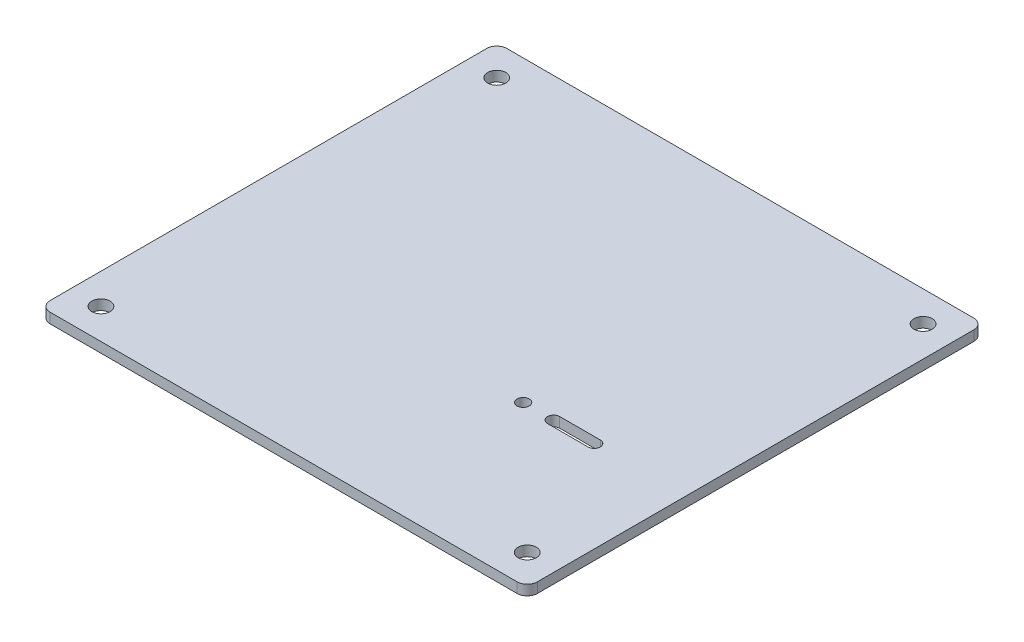
ISO-10303-21;
HEADER;
FILE_DESCRIPTION(('STEP AP214'),'2;1');
FILE_NAME('part.step','',(''),(''),'','','');
FILE_SCHEMA(('AUTOMOTIVE_DESIGN { 1 0 10303 214 1 1 1 1 }'));
ENDSEC;
DATA;
#1=APPLICATION_CONTEXT('core data for automotive mechanical design processes');
#2=APPLICATION_PROTOCOL_DEFINITION('international standard','automotive_design',2000,#1);
#3=PRODUCT_CONTEXT('',#1,'mechanical');
#4=PRODUCT('Part','Part','',(#3));
#5=PRODUCT_RELATED_PRODUCT_CATEGORY('part','',(#4));
#6=PRODUCT_DEFINITION_FORMATION('','',#4);
#7=PRODUCT_DEFINITION_CONTEXT('part definition',#1,'design');
#8=PRODUCT_DEFINITION('design','',#6,#7);
#9=PRODUCT_DEFINITION_SHAPE('','',#8);
#10=(LENGTH_UNIT() NAMED_UNIT(*) SI_UNIT(.MILLI.,.METRE.));
#11=(NAMED_UNIT(*) PLANE_ANGLE_UNIT() SI_UNIT($,.RADIAN.));
#12=(NAMED_UNIT(*) SI_UNIT($,.STERADIAN.) SOLID_ANGLE_UNIT());
#13=UNCERTAINTY_MEASURE_WITH_UNIT(LENGTH_MEASURE(1.E-05),#10,'distance_accuracy_value','');
#14=(GEOMETRIC_REPRESENTATION_CONTEXT(3) GLOBAL_UNCERTAINTY_ASSIGNED_CONTEXT((#13)) GLOBAL_UNIT_ASSIGNED_CONTEXT((#10,
#11,#12)) REPRESENTATION_CONTEXT('',''));
#15=CARTESIAN_POINT('',(0.,0.,0.));
#16=DIRECTION('',(0.,0.,1.));
#17=DIRECTION('',(1.,0.,0.));
#18=AXIS2_PLACEMENT_3D('',#15,#16,#17);
#19=CARTESIAN_POINT('',(0.,5.,0.));
#20=DIRECTION('',(1.,0.,0.));
#21=DIRECTION('',(0.,0.,-1.));
#22=AXIS2_PLACEMENT_3D('',#19,#20,#21);
#23=PLANE('',#22);
#24=DIRECTION('',(0.,0.,1.));
#25=VECTOR('',#24,1.);
#26=CARTESIAN_POINT('',(0.,5.,0.));
#27=LINE('',#26,#25);
#28=CARTESIAN_POINT('',(0.,5.,-220.));
#29=VERTEX_POINT('',#28);
#30=CARTESIAN_POINT('',(0.,5.,-5.));
#31=VERTEX_POINT('',#30);
#32=EDGE_CURVE('E181',#29,#31,#27,.T.);
#33=ORIENTED_EDGE('',*,*,#32,.F.);
#34=DIRECTION('',(0.,1.,0.));
#35=VECTOR('',#34,1.);
#36=CARTESIAN_POINT('',(0.,0.,-220.));
#37=LINE('',#36,#35);
#38=CARTESIAN_POINT('',(0.,0.,-220.));
#39=VERTEX_POINT('',#38);
#40=EDGE_CURVE('E206',#29,#39,#37,.F.);
#41=ORIENTED_EDGE('',*,*,#40,.T.);
#42=DIRECTION('',(0.,0.,1.));
#43=VECTOR('',#42,1.);
#44=CARTESIAN_POINT('',(0.,0.,0.));
#45=LINE('',#44,#43);
#46=CARTESIAN_POINT('',(0.,0.,-5.));
#47=VERTEX_POINT('',#46);
#48=EDGE_CURVE('E171',#39,#47,#45,.T.);
#49=ORIENTED_EDGE('',*,*,#48,.T.);
#50=DIRECTION('',(0.,-1.,0.));
#51=VECTOR('',#50,1.);
#52=CARTESIAN_POINT('',(0.,5.,-5.));
#53=LINE('',#52,#51);
#54=EDGE_CURVE('E204',#47,#31,#53,.F.);
#55=ORIENTED_EDGE('',*,*,#54,.T.);
#56=EDGE_LOOP('',(#33,#41,#49,#55));
#57=FACE_BOUND('',#56,.T.);
#58=ADVANCED_FACE('F35',(#57),#23,.F.);
#59=CARTESIAN_POINT('',(0.,5.,0.));
#60=DIRECTION('',(0.,0.,-1.));
#61=DIRECTION('',(-1.,0.,0.));
#62=AXIS2_PLACEMENT_3D('',#59,#60,#61);
#63=PLANE('',#62);
#64=DIRECTION('',(1.,0.,0.));
#65=VECTOR('',#64,1.);
#66=CARTESIAN_POINT('',(0.,0.,0.));
#67=LINE('',#66,#65);
#68=CARTESIAN_POINT('',(5.,0.,0.));
#69=VERTEX_POINT('',#68);
#70=CARTESIAN_POINT('',(235.,0.,0.));
#71=VERTEX_POINT('',#70);
#72=EDGE_CURVE('E185',#69,#71,#67,.T.);
#73=ORIENTED_EDGE('',*,*,#72,.T.);
#74=DIRECTION('',(0.,1.,0.));
#75=VECTOR('',#74,1.);
#76=CARTESIAN_POINT('',(235.,5.,0.));
#77=LINE('',#76,#75);
#78=CARTESIAN_POINT('',(235.,5.,0.));
#79=VERTEX_POINT('',#78);
#80=EDGE_CURVE('E11',#71,#79,#77,.T.);
#81=ORIENTED_EDGE('',*,*,#80,.T.);
#82=DIRECTION('',(1.,0.,0.));
#83=VECTOR('',#82,1.);
#84=CARTESIAN_POINT('',(0.,5.,0.));
#85=LINE('',#84,#83);
#86=CARTESIAN_POINT('',(5.,5.,0.));
#87=VERTEX_POINT('',#86);
#88=EDGE_CURVE('E184',#87,#79,#85,.T.);
#89=ORIENTED_EDGE('',*,*,#88,.F.);
#90=DIRECTION('',(0.,-1.,0.));
#91=VECTOR('',#90,1.);
#92=CARTESIAN_POINT('',(5.,5.,0.));
#93=LINE('',#92,#91);
#94=EDGE_CURVE('E43',#87,#69,#93,.T.);
#95=ORIENTED_EDGE('',*,*,#94,.T.);
#96=EDGE_LOOP('',(#73,#81,#89,#95));
#97=FACE_BOUND('',#96,.T.);
#98=ADVANCED_FACE('F220',(#97),#63,.F.);
#99=CARTESIAN_POINT('',(0.,5.,0.));
#100=DIRECTION('',(0.,-1.,0.));
#101=DIRECTION('',(0.,0.,-1.));
#102=AXIS2_PLACEMENT_3D('',#99,#100,#101);
#103=PLANE('',#102);
#104=CARTESIAN_POINT('',(15.,5.,-15.));
#105=DIRECTION('',(0.,1.,0.));
#106=DIRECTION('',(0.,0.,1.));
#107=AXIS2_PLACEMENT_3D('',#104,#105,#106);
#108=CIRCLE('',#107,4.49999999999999);
#109=CARTESIAN_POINT('',(15.,5.,-10.5));
#110=VERTEX_POINT('',#109);
#111=EDGE_CURVE('E321',#110,#110,#108,.T.);
#112=ORIENTED_EDGE('',*,*,#111,.F.);
#113=EDGE_LOOP('',(#112));
#114=FACE_BOUND('',#113,.T.);
#115=CARTESIAN_POINT('',(225.,5.,-15.));
#116=DIRECTION('',(0.,1.,0.));
#117=DIRECTION('',(0.,0.,1.));
#118=AXIS2_PLACEMENT_3D('',#115,#116,#117);
#119=CIRCLE('',#118,4.49999999999998);
#120=CARTESIAN_POINT('',(225.,5.,-10.5));
#121=VERTEX_POINT('',#120);
#122=EDGE_CURVE('E323',#121,#121,#119,.T.);
#123=ORIENTED_EDGE('',*,*,#122,.F.);
#124=EDGE_LOOP('',(#123));
#125=FACE_BOUND('',#124,.T.);
#126=CARTESIAN_POINT('',(225.,5.,-210.));
#127=DIRECTION('',(0.,1.,0.));
#128=DIRECTION('',(0.,0.,1.));
#129=AXIS2_PLACEMENT_3D('',#126,#127,#128);
#130=CIRCLE('',#129,4.49999999999998);
#131=CARTESIAN_POINT('',(225.,5.,-205.5));
#132=VERTEX_POINT('',#131);
#133=EDGE_CURVE('E331',#132,#132,#130,.T.);
#134=ORIENTED_EDGE('',*,*,#133,.F.);
#135=EDGE_LOOP('',(#134));
#136=FACE_BOUND('',#135,.T.);
#137=CARTESIAN_POINT('',(15.,5.,-210.));
#138=DIRECTION('',(0.,1.,0.));
#139=DIRECTION('',(0.,0.,1.));
#140=AXIS2_PLACEMENT_3D('',#137,#138,#139);
#141=CIRCLE('',#140,4.49999999999999);
#142=CARTESIAN_POINT('',(15.,5.,-205.5));
#143=VERTEX_POINT('',#142);
#144=EDGE_CURVE('E337',#143,#143,#141,.T.);
#145=ORIENTED_EDGE('',*,*,#144,.F.);
#146=EDGE_LOOP('',(#145));
#147=FACE_BOUND('',#146,.T.);
#148=DIRECTION('',(1.,0.,0.));
#149=VECTOR('',#148,1.);
#150=CARTESIAN_POINT('',(174.999156247034,5.,-75.));
#151=LINE('',#150,#149);
#152=CARTESIAN_POINT('',(174.999156247034,5.,-75.));
#153=VERTEX_POINT('',#152);
#154=CARTESIAN_POINT('',(194.999156247034,5.,-75.));
#155=VERTEX_POINT('',#154);
#156=EDGE_CURVE('E164',#153,#155,#151,.T.);
#157=ORIENTED_EDGE('',*,*,#156,.F.);
#158=CARTESIAN_POINT('',(174.999156247034,5.,-78.));
#159=DIRECTION('',(0.,1.,0.));
#160=DIRECTION('',(0.,0.,1.));
#161=AXIS2_PLACEMENT_3D('',#158,#159,#160);
#162=CIRCLE('',#161,3.);
#163=CARTESIAN_POINT('',(174.999156247034,5.,-81.));
#164=VERTEX_POINT('',#163);
#165=EDGE_CURVE('E134',#164,#153,#162,.T.);
#166=ORIENTED_EDGE('',*,*,#165,.F.);
#167=DIRECTION('',(-1.,0.,0.));
#168=VECTOR('',#167,1.);
#169=CARTESIAN_POINT('',(174.999156247034,5.,-81.));
#170=LINE('',#169,#168);
#171=CARTESIAN_POINT('',(194.999156247034,5.,-81.));
#172=VERTEX_POINT('',#171);
#173=EDGE_CURVE('E152',#172,#164,#170,.T.);
#174=ORIENTED_EDGE('',*,*,#173,.F.);
#175=CARTESIAN_POINT('',(194.999156247034,5.,-78.));
#176=DIRECTION('',(0.,1.,0.));
#177=DIRECTION('',(0.,0.,1.));
#178=AXIS2_PLACEMENT_3D('',#175,#176,#177);
#179=CIRCLE('',#178,3.);
#180=EDGE_CURVE('E155',#155,#172,#179,.T.);
#181=ORIENTED_EDGE('',*,*,#180,.F.);
#182=EDGE_LOOP('',(#157,#166,#174,#181));
#183=FACE_BOUND('',#182,.T.);
#184=CARTESIAN_POINT('',(159.999156247034,5.,-78.));
#185=DIRECTION('',(0.,1.,0.));
#186=DIRECTION('',(0.,0.,1.));
#187=AXIS2_PLACEMENT_3D('',#184,#185,#186);
#188=CIRCLE('',#187,2.99999999999996);
#189=CARTESIAN_POINT('',(159.999156247034,5.,-75.));
#190=VERTEX_POINT('',#189);
#191=EDGE_CURVE('E177',#190,#190,#188,.T.);
#192=ORIENTED_EDGE('',*,*,#191,.F.);
#193=EDGE_LOOP('',(#192));
#194=FACE_BOUND('',#193,.T.);
#195=DIRECTION('',(-1.,0.,0.));
#196=VECTOR('',#195,1.);
#197=CARTESIAN_POINT('',(240.,5.,-225.));
#198=LINE('',#197,#196);
#199=CARTESIAN_POINT('',(235.,5.,-225.));
#200=VERTEX_POINT('',#199);
#201=CARTESIAN_POINT('',(5.,5.,-225.));
#202=VERTEX_POINT('',#201);
#203=EDGE_CURVE('E242',#200,#202,#198,.T.);
#204=ORIENTED_EDGE('',*,*,#203,.T.);
#205=CARTESIAN_POINT('',(5.,5.,-220.));
#206=DIRECTION('',(0.,-1.,0.));
#207=DIRECTION('',(0.,0.,-1.));
#208=AXIS2_PLACEMENT_3D('',#205,#206,#207);
#209=CIRCLE('',#208,5.);
#210=EDGE_CURVE('E202',#202,#29,#209,.F.);
#211=ORIENTED_EDGE('',*,*,#210,.T.);
#212=ORIENTED_EDGE('',*,*,#32,.T.);
#213=CARTESIAN_POINT('',(5.,5.,-5.));
#214=DIRECTION('',(0.,-1.,0.));
#215=DIRECTION('',(0.,0.,-1.));
#216=AXIS2_PLACEMENT_3D('',#213,#214,#215);
#217=CIRCLE('',#216,5.);
#218=EDGE_CURVE('E196',#31,#87,#217,.F.);
#219=ORIENTED_EDGE('',*,*,#218,.T.);
#220=ORIENTED_EDGE('',*,*,#88,.T.);
#221=CARTESIAN_POINT('',(235.,5.,-5.));
#222=DIRECTION('',(0.,-1.,0.));
#223=DIRECTION('',(0.,0.,-1.));
#224=AXIS2_PLACEMENT_3D('',#221,#222,#223);
#225=CIRCLE('',#224,5.);
#226=CARTESIAN_POINT('',(240.,5.,-5.));
#227=VERTEX_POINT('',#226);
#228=EDGE_CURVE('E198',#79,#227,#225,.F.);
#229=ORIENTED_EDGE('',*,*,#228,.T.);
#230=DIRECTION('',(0.,0.,1.));
#231=VECTOR('',#230,1.);
#232=CARTESIAN_POINT('',(240.,5.,-200.));
#233=LINE('',#232,#231);
#234=CARTESIAN_POINT('',(240.,5.,-220.));
#235=VERTEX_POINT('',#234);
#236=EDGE_CURVE('E158',#235,#227,#233,.T.);
#237=ORIENTED_EDGE('',*,*,#236,.F.);
#238=CARTESIAN_POINT('',(235.,5.,-220.));
#239=DIRECTION('',(0.,-1.,0.));
#240=DIRECTION('',(0.,0.,-1.));
#241=AXIS2_PLACEMENT_3D('',#238,#239,#240);
#242=CIRCLE('',#241,5.);
#243=EDGE_CURVE('E200',#235,#200,#242,.F.);
#244=ORIENTED_EDGE('',*,*,#243,.T.);
#245=EDGE_LOOP('',(#204,#211,#212,#219,#220,#229,#237,#244));
#246=FACE_BOUND('',#245,.T.);
#247=ADVANCED_FACE('F230',(#114,#125,#136,#147,#183,#194,#246),#103,.F.);
#248=CARTESIAN_POINT('',(0.,0.,0.));
#249=DIRECTION('',(0.,-1.,0.));
#250=DIRECTION('',(0.,0.,-1.));
#251=AXIS2_PLACEMENT_3D('',#248,#249,#250);
#252=PLANE('',#251);
#253=CARTESIAN_POINT('',(15.,0.,-15.));
#254=DIRECTION('',(0.,1.,0.));
#255=DIRECTION('',(0.,0.,1.));
#256=AXIS2_PLACEMENT_3D('',#253,#254,#255);
#257=CIRCLE('',#256,4.5);
#258=CARTESIAN_POINT('',(15.,0.,-10.5));
#259=VERTEX_POINT('',#258);
#260=EDGE_CURVE('E318',#259,#259,#257,.T.);
#261=ORIENTED_EDGE('',*,*,#260,.T.);
#262=EDGE_LOOP('',(#261));
#263=FACE_BOUND('',#262,.T.);
#264=CARTESIAN_POINT('',(225.,0.,-15.));
#265=DIRECTION('',(0.,1.,0.));
#266=DIRECTION('',(0.,0.,1.));
#267=AXIS2_PLACEMENT_3D('',#264,#265,#266);
#268=CIRCLE('',#267,4.5);
#269=CARTESIAN_POINT('',(225.,0.,-10.5));
#270=VERTEX_POINT('',#269);
#271=EDGE_CURVE('E328',#270,#270,#268,.T.);
#272=ORIENTED_EDGE('',*,*,#271,.T.);
#273=EDGE_LOOP('',(#272));
#274=FACE_BOUND('',#273,.T.);
#275=CARTESIAN_POINT('',(225.,0.,-210.));
#276=DIRECTION('',(0.,1.,0.));
#277=DIRECTION('',(0.,0.,1.));
#278=AXIS2_PLACEMENT_3D('',#275,#276,#277);
#279=CIRCLE('',#278,4.5);
#280=CARTESIAN_POINT('',(225.,0.,-205.5));
#281=VERTEX_POINT('',#280);
#282=EDGE_CURVE('E334',#281,#281,#279,.T.);
#283=ORIENTED_EDGE('',*,*,#282,.T.);
#284=EDGE_LOOP('',(#283));
#285=FACE_BOUND('',#284,.T.);
#286=CARTESIAN_POINT('',(15.,0.,-210.));
#287=DIRECTION('',(0.,1.,0.));
#288=DIRECTION('',(0.,0.,1.));
#289=AXIS2_PLACEMENT_3D('',#286,#287,#288);
#290=CIRCLE('',#289,4.5);
#291=CARTESIAN_POINT('',(15.,0.,-205.5));
#292=VERTEX_POINT('',#291);
#293=EDGE_CURVE('E245',#292,#292,#290,.T.);
#294=ORIENTED_EDGE('',*,*,#293,.T.);
#295=EDGE_LOOP('',(#294));
#296=FACE_BOUND('',#295,.T.);
#297=ORIENTED_EDGE('',*,*,#48,.F.);
#298=CARTESIAN_POINT('',(5.,0.,-220.));
#299=DIRECTION('',(0.,-1.,0.));
#300=DIRECTION('',(0.,0.,-1.));
#301=AXIS2_PLACEMENT_3D('',#298,#299,#300);
#302=CIRCLE('',#301,5.);
#303=CARTESIAN_POINT('',(5.,0.,-225.));
#304=VERTEX_POINT('',#303);
#305=EDGE_CURVE('E212',#39,#304,#302,.T.);
#306=ORIENTED_EDGE('',*,*,#305,.T.);
#307=DIRECTION('',(-1.,0.,0.));
#308=VECTOR('',#307,1.);
#309=CARTESIAN_POINT('',(240.,0.,-225.));
#310=LINE('',#309,#308);
#311=CARTESIAN_POINT('',(235.,0.,-225.));
#312=VERTEX_POINT('',#311);
#313=EDGE_CURVE('E236',#312,#304,#310,.T.);
#314=ORIENTED_EDGE('',*,*,#313,.F.);
#315=CARTESIAN_POINT('',(235.,0.,-220.));
#316=DIRECTION('',(0.,-1.,0.));
#317=DIRECTION('',(0.,0.,-1.));
#318=AXIS2_PLACEMENT_3D('',#315,#316,#317);
#319=CIRCLE('',#318,5.);
#320=CARTESIAN_POINT('',(240.,0.,-220.));
#321=VERTEX_POINT('',#320);
#322=EDGE_CURVE('E210',#312,#321,#319,.T.);
#323=ORIENTED_EDGE('',*,*,#322,.T.);
#324=DIRECTION('',(0.,0.,1.));
#325=VECTOR('',#324,1.);
#326=CARTESIAN_POINT('',(240.,0.,-200.));
#327=LINE('',#326,#325);
#328=CARTESIAN_POINT('',(240.,0.,-5.));
#329=VERTEX_POINT('',#328);
#330=EDGE_CURVE('E180',#321,#329,#327,.T.);
#331=ORIENTED_EDGE('',*,*,#330,.T.);
#332=CARTESIAN_POINT('',(235.,0.,-5.));
#333=DIRECTION('',(0.,-1.,0.));
#334=DIRECTION('',(0.,0.,-1.));
#335=AXIS2_PLACEMENT_3D('',#332,#333,#334);
#336=CIRCLE('',#335,5.);
#337=EDGE_CURVE('E50',#329,#71,#336,.T.);
#338=ORIENTED_EDGE('',*,*,#337,.T.);
#339=ORIENTED_EDGE('',*,*,#72,.F.);
#340=CARTESIAN_POINT('',(5.,0.,-5.));
#341=DIRECTION('',(0.,-1.,0.));
#342=DIRECTION('',(0.,0.,-1.));
#343=AXIS2_PLACEMENT_3D('',#340,#341,#342);
#344=CIRCLE('',#343,5.);
#345=EDGE_CURVE('E58',#69,#47,#344,.T.);
#346=ORIENTED_EDGE('',*,*,#345,.T.);
#347=EDGE_LOOP('',(#297,#306,#314,#323,#331,#338,#339,#346));
#348=FACE_BOUND('',#347,.T.);
#349=CARTESIAN_POINT('',(174.999156247034,0.,-78.));
#350=DIRECTION('',(0.,1.,0.));
#351=DIRECTION('',(0.,0.,1.));
#352=AXIS2_PLACEMENT_3D('',#349,#350,#351);
#353=CIRCLE('',#352,3.);
#354=CARTESIAN_POINT('',(174.999156247034,0.,-81.));
#355=VERTEX_POINT('',#354);
#356=CARTESIAN_POINT('',(174.999156247034,0.,-75.));
#357=VERTEX_POINT('',#356);
#358=EDGE_CURVE('E131',#355,#357,#353,.T.);
#359=ORIENTED_EDGE('',*,*,#358,.T.);
#360=DIRECTION('',(1.,0.,0.));
#361=VECTOR('',#360,1.);
#362=CARTESIAN_POINT('',(174.999156247034,0.,-75.));
#363=LINE('',#362,#361);
#364=CARTESIAN_POINT('',(194.999156247034,0.,-75.));
#365=VERTEX_POINT('',#364);
#366=EDGE_CURVE('E143',#357,#365,#363,.T.);
#367=ORIENTED_EDGE('',*,*,#366,.T.);
#368=CARTESIAN_POINT('',(194.999156247034,0.,-78.));
#369=DIRECTION('',(0.,1.,0.));
#370=DIRECTION('',(0.,0.,1.));
#371=AXIS2_PLACEMENT_3D('',#368,#369,#370);
#372=CIRCLE('',#371,3.);
#373=CARTESIAN_POINT('',(194.999156247034,0.,-81.));
#374=VERTEX_POINT('',#373);
#375=EDGE_CURVE('E147',#365,#374,#372,.T.);
#376=ORIENTED_EDGE('',*,*,#375,.T.);
#377=DIRECTION('',(-1.,0.,0.));
#378=VECTOR('',#377,1.);
#379=CARTESIAN_POINT('',(174.999156247034,0.,-81.));
#380=LINE('',#379,#378);
#381=EDGE_CURVE('E139',#374,#355,#380,.T.);
#382=ORIENTED_EDGE('',*,*,#381,.T.);
#383=EDGE_LOOP('',(#359,#367,#376,#382));
#384=FACE_BOUND('',#383,.T.);
#385=CARTESIAN_POINT('',(159.999156247034,0.,-78.));
#386=DIRECTION('',(0.,1.,0.));
#387=DIRECTION('',(0.,0.,1.));
#388=AXIS2_PLACEMENT_3D('',#385,#386,#387);
#389=CIRCLE('',#388,2.99999999999996);
#390=CARTESIAN_POINT('',(159.999156247034,0.,-75.));
#391=VERTEX_POINT('',#390);
#392=EDGE_CURVE('E165',#391,#391,#389,.T.);
#393=ORIENTED_EDGE('',*,*,#392,.T.);
#394=EDGE_LOOP('',(#393));
#395=FACE_BOUND('',#394,.T.);
#396=ADVANCED_FACE('F149',(#263,#274,#285,#296,#348,#384,#395),#252,.T.);
#397=CARTESIAN_POINT('',(159.999156247034,0.,-78.));
#398=DIRECTION('',(0.,1.,0.));
#399=DIRECTION('',(0.,0.,1.));
#400=AXIS2_PLACEMENT_3D('',#397,#398,#399);
#401=CYLINDRICAL_SURFACE('',#400,2.99999999999996);
#402=ORIENTED_EDGE('',*,*,#392,.F.);
#403=EDGE_LOOP('',(#402));
#404=FACE_BOUND('',#403,.T.);
#405=ORIENTED_EDGE('',*,*,#191,.T.);
#406=EDGE_LOOP('',(#405));
#407=FACE_BOUND('',#406,.T.);
#408=ADVANCED_FACE('F275',(#404,#407),#401,.F.);
#409=CARTESIAN_POINT('',(174.999156247034,0.,-78.));
#410=DIRECTION('',(0.,1.,0.));
#411=DIRECTION('',(0.,0.,1.));
#412=AXIS2_PLACEMENT_3D('',#409,#410,#411);
#413=CYLINDRICAL_SURFACE('',#412,3.);
#414=ORIENTED_EDGE('',*,*,#165,.T.);
#415=DIRECTION('',(0.,1.,0.));
#416=VECTOR('',#415,1.);
#417=CARTESIAN_POINT('',(174.999156247034,0.,-75.));
#418=LINE('',#417,#416);
#419=EDGE_CURVE('E127',#357,#153,#418,.T.);
#420=ORIENTED_EDGE('',*,*,#419,.F.);
#421=ORIENTED_EDGE('',*,*,#358,.F.);
#422=DIRECTION('',(0.,1.,0.));
#423=VECTOR('',#422,1.);
#424=CARTESIAN_POINT('',(174.999156247034,0.,-81.));
#425=LINE('',#424,#423);
#426=EDGE_CURVE('E169',#355,#164,#425,.T.);
#427=ORIENTED_EDGE('',*,*,#426,.T.);
#428=EDGE_LOOP('',(#414,#420,#421,#427));
#429=FACE_BOUND('',#428,.T.);
#430=ADVANCED_FACE('F129',(#429),#413,.F.);
#431=CARTESIAN_POINT('',(174.999156247034,0.,-81.));
#432=DIRECTION('',(0.,0.,-1.));
#433=DIRECTION('',(-1.,0.,0.));
#434=AXIS2_PLACEMENT_3D('',#431,#432,#433);
#435=PLANE('',#434);
#436=ORIENTED_EDGE('',*,*,#173,.T.);
#437=ORIENTED_EDGE('',*,*,#426,.F.);
#438=ORIENTED_EDGE('',*,*,#381,.F.);
#439=DIRECTION('',(0.,1.,0.));
#440=VECTOR('',#439,1.);
#441=CARTESIAN_POINT('',(194.999156247034,0.,-81.));
#442=LINE('',#441,#440);
#443=EDGE_CURVE('E172',#374,#172,#442,.T.);
#444=ORIENTED_EDGE('',*,*,#443,.T.);
#445=EDGE_LOOP('',(#436,#437,#438,#444));
#446=FACE_BOUND('',#445,.T.);
#447=ADVANCED_FACE('F285',(#446),#435,.F.);
#448=CARTESIAN_POINT('',(194.999156247034,0.,-78.));
#449=DIRECTION('',(0.,1.,0.));
#450=DIRECTION('',(0.,0.,1.));
#451=AXIS2_PLACEMENT_3D('',#448,#449,#450);
#452=CYLINDRICAL_SURFACE('',#451,3.);
#453=ORIENTED_EDGE('',*,*,#180,.T.);
#454=ORIENTED_EDGE('',*,*,#443,.F.);
#455=ORIENTED_EDGE('',*,*,#375,.F.);
#456=DIRECTION('',(0.,1.,0.));
#457=VECTOR('',#456,1.);
#458=CARTESIAN_POINT('',(194.999156247034,0.,-75.));
#459=LINE('',#458,#457);
#460=EDGE_CURVE('E138',#365,#155,#459,.T.);
#461=ORIENTED_EDGE('',*,*,#460,.T.);
#462=EDGE_LOOP('',(#453,#454,#455,#461));
#463=FACE_BOUND('',#462,.T.);
#464=ADVANCED_FACE('F288',(#463),#452,.F.);
#465=CARTESIAN_POINT('',(174.999156247034,0.,-75.));
#466=DIRECTION('',(0.,0.,1.));
#467=DIRECTION('',(1.,0.,0.));
#468=AXIS2_PLACEMENT_3D('',#465,#466,#467);
#469=PLANE('',#468);
#470=ORIENTED_EDGE('',*,*,#156,.T.);
#471=ORIENTED_EDGE('',*,*,#460,.F.);
#472=ORIENTED_EDGE('',*,*,#366,.F.);
#473=ORIENTED_EDGE('',*,*,#419,.T.);
#474=EDGE_LOOP('',(#470,#471,#472,#473));
#475=FACE_BOUND('',#474,.T.);
#476=ADVANCED_FACE('F144',(#475),#469,.F.);
#477=CARTESIAN_POINT('',(240.,0.,-200.));
#478=DIRECTION('',(-1.,0.,0.));
#479=DIRECTION('',(0.,0.,1.));
#480=AXIS2_PLACEMENT_3D('',#477,#478,#479);
#481=PLANE('',#480);
#482=ORIENTED_EDGE('',*,*,#330,.F.);
#483=DIRECTION('',(0.,1.,0.));
#484=VECTOR('',#483,1.);
#485=CARTESIAN_POINT('',(240.,5.,-220.));
#486=LINE('',#485,#484);
#487=EDGE_CURVE('E216',#321,#235,#486,.T.);
#488=ORIENTED_EDGE('',*,*,#487,.T.);
#489=ORIENTED_EDGE('',*,*,#236,.T.);
#490=DIRECTION('',(0.,1.,0.));
#491=VECTOR('',#490,1.);
#492=CARTESIAN_POINT('',(240.,0.,-5.));
#493=LINE('',#492,#491);
#494=EDGE_CURVE('E214',#227,#329,#493,.F.);
#495=ORIENTED_EDGE('',*,*,#494,.T.);
#496=EDGE_LOOP('',(#482,#488,#489,#495));
#497=FACE_BOUND('',#496,.T.);
#498=ADVANCED_FACE('F255',(#497),#481,.F.);
#499=CARTESIAN_POINT('',(240.,-241.298570240273,-225.));
#500=DIRECTION('',(0.,0.,-1.));
#501=DIRECTION('',(-1.,0.,0.));
#502=AXIS2_PLACEMENT_3D('',#499,#500,#501);
#503=PLANE('',#502);
#504=ORIENTED_EDGE('',*,*,#313,.T.);
#505=DIRECTION('',(0.,1.,0.));
#506=VECTOR('',#505,1.);
#507=CARTESIAN_POINT('',(5.,5.,-225.));
#508=LINE('',#507,#506);
#509=EDGE_CURVE('E193',#304,#202,#508,.T.);
#510=ORIENTED_EDGE('',*,*,#509,.T.);
#511=ORIENTED_EDGE('',*,*,#203,.F.);
#512=DIRECTION('',(0.,1.,0.));
#513=VECTOR('',#512,1.);
#514=CARTESIAN_POINT('',(235.,0.,-225.));
#515=LINE('',#514,#513);
#516=EDGE_CURVE('E188',#200,#312,#515,.F.);
#517=ORIENTED_EDGE('',*,*,#516,.T.);
#518=EDGE_LOOP('',(#504,#510,#511,#517));
#519=FACE_BOUND('',#518,.T.);
#520=ADVANCED_FACE('F239',(#519),#503,.T.);
#521=CARTESIAN_POINT('',(15.,5.,-210.));
#522=DIRECTION('',(0.,1.,0.));
#523=DIRECTION('',(0.,0.,1.));
#524=AXIS2_PLACEMENT_3D('',#521,#522,#523);
#525=CYLINDRICAL_SURFACE('',#524,4.49999999999999);
#526=ORIENTED_EDGE('',*,*,#293,.F.);
#527=EDGE_LOOP('',(#526));
#528=FACE_BOUND('',#527,.T.);
#529=ORIENTED_EDGE('',*,*,#144,.T.);
#530=EDGE_LOOP('',(#529));
#531=FACE_BOUND('',#530,.T.);
#532=ADVANCED_FACE('F299',(#528,#531),#525,.F.);
#533=CARTESIAN_POINT('',(225.,5.,-210.));
#534=DIRECTION('',(0.,1.,0.));
#535=DIRECTION('',(0.,0.,1.));
#536=AXIS2_PLACEMENT_3D('',#533,#534,#535);
#537=CYLINDRICAL_SURFACE('',#536,4.49999999999999);
#538=ORIENTED_EDGE('',*,*,#282,.F.);
#539=EDGE_LOOP('',(#538));
#540=FACE_BOUND('',#539,.T.);
#541=ORIENTED_EDGE('',*,*,#133,.T.);
#542=EDGE_LOOP('',(#541));
#543=FACE_BOUND('',#542,.T.);
#544=ADVANCED_FACE('F302',(#540,#543),#537,.F.);
#545=CARTESIAN_POINT('',(225.,5.,-15.));
#546=DIRECTION('',(0.,1.,0.));
#547=DIRECTION('',(0.,0.,1.));
#548=AXIS2_PLACEMENT_3D('',#545,#546,#547);
#549=CYLINDRICAL_SURFACE('',#548,4.49999999999999);
#550=ORIENTED_EDGE('',*,*,#271,.F.);
#551=EDGE_LOOP('',(#550));
#552=FACE_BOUND('',#551,.T.);
#553=ORIENTED_EDGE('',*,*,#122,.T.);
#554=EDGE_LOOP('',(#553));
#555=FACE_BOUND('',#554,.T.);
#556=ADVANCED_FACE('F306',(#552,#555),#549,.F.);
#557=CARTESIAN_POINT('',(15.,5.,-15.));
#558=DIRECTION('',(0.,1.,0.));
#559=DIRECTION('',(0.,0.,1.));
#560=AXIS2_PLACEMENT_3D('',#557,#558,#559);
#561=CYLINDRICAL_SURFACE('',#560,4.49999999999999);
#562=ORIENTED_EDGE('',*,*,#260,.F.);
#563=EDGE_LOOP('',(#562));
#564=FACE_BOUND('',#563,.T.);
#565=ORIENTED_EDGE('',*,*,#111,.T.);
#566=EDGE_LOOP('',(#565));
#567=FACE_BOUND('',#566,.T.);
#568=ADVANCED_FACE('F264',(#564,#567),#561,.F.);
#569=CARTESIAN_POINT('',(5.,-241.298570240273,-220.));
#570=DIRECTION('',(0.,-1.,0.));
#571=DIRECTION('',(0.,0.,-1.));
#572=AXIS2_PLACEMENT_3D('',#569,#570,#571);
#573=CYLINDRICAL_SURFACE('',#572,5.);
#574=ORIENTED_EDGE('',*,*,#305,.F.);
#575=ORIENTED_EDGE('',*,*,#40,.F.);
#576=ORIENTED_EDGE('',*,*,#210,.F.);
#577=ORIENTED_EDGE('',*,*,#509,.F.);
#578=EDGE_LOOP('',(#574,#575,#576,#577));
#579=FACE_BOUND('',#578,.T.);
#580=ADVANCED_FACE('F232',(#579),#573,.T.);
#581=CARTESIAN_POINT('',(235.,0.,-220.));
#582=DIRECTION('',(0.,-1.,0.));
#583=DIRECTION('',(0.,0.,-1.));
#584=AXIS2_PLACEMENT_3D('',#581,#582,#583);
#585=CYLINDRICAL_SURFACE('',#584,5.);
#586=ORIENTED_EDGE('',*,*,#322,.F.);
#587=ORIENTED_EDGE('',*,*,#516,.F.);
#588=ORIENTED_EDGE('',*,*,#243,.F.);
#589=ORIENTED_EDGE('',*,*,#487,.F.);
#590=EDGE_LOOP('',(#586,#587,#588,#589));
#591=FACE_BOUND('',#590,.T.);
#592=ADVANCED_FACE('F257',(#591),#585,.T.);
#593=CARTESIAN_POINT('',(235.,5.,-5.));
#594=DIRECTION('',(0.,1.,0.));
#595=DIRECTION('',(0.,0.,1.));
#596=AXIS2_PLACEMENT_3D('',#593,#594,#595);
#597=CYLINDRICAL_SURFACE('',#596,5.);
#598=ORIENTED_EDGE('',*,*,#337,.F.);
#599=ORIENTED_EDGE('',*,*,#494,.F.);
#600=ORIENTED_EDGE('',*,*,#228,.F.);
#601=ORIENTED_EDGE('',*,*,#80,.F.);
#602=EDGE_LOOP('',(#598,#599,#600,#601));
#603=FACE_BOUND('',#602,.T.);
#604=ADVANCED_FACE('F253',(#603),#597,.T.);
#605=CARTESIAN_POINT('',(5.,5.,-5.));
#606=DIRECTION('',(0.,-1.,0.));
#607=DIRECTION('',(0.,0.,-1.));
#608=AXIS2_PLACEMENT_3D('',#605,#606,#607);
#609=CYLINDRICAL_SURFACE('',#608,5.);
#610=ORIENTED_EDGE('',*,*,#218,.F.);
#611=ORIENTED_EDGE('',*,*,#54,.F.);
#612=ORIENTED_EDGE('',*,*,#345,.F.);
#613=ORIENTED_EDGE('',*,*,#94,.F.);
#614=EDGE_LOOP('',(#610,#611,#612,#613));
#615=FACE_BOUND('',#614,.T.);
#616=ADVANCED_FACE('F37',(#615),#609,.T.);
#617=CLOSED_SHELL('',(#58,#98,#247,#396,#408,#430,#447,#464,#476,#498,#520,#532,#544,#556,#568,
#580,#592,#604,#616));
#618=MANIFOLD_SOLID_BREP('B2',#617);
#619=ADVANCED_BREP_SHAPE_REPRESENTATION('',(#18,#618),#14);
#620=SHAPE_DEFINITION_REPRESENTATION(#9,#619);
ENDSEC;
END-ISO-10303-21;
